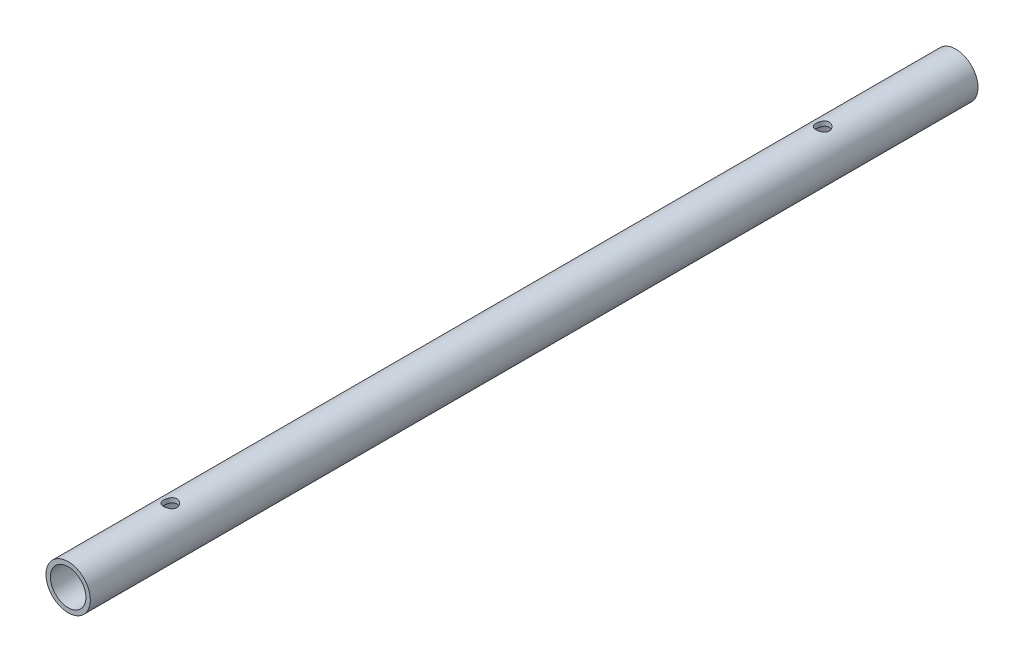
ISO-10303-21;
HEADER;
FILE_DESCRIPTION(('STEP AP214'),'2;1');
FILE_NAME('part.step','',(''),(''),'','','');
FILE_SCHEMA(('AUTOMOTIVE_DESIGN { 1 0 10303 214 1 1 1 1 }'));
ENDSEC;
DATA;
#1=APPLICATION_CONTEXT('core data for automotive mechanical design processes');
#2=APPLICATION_PROTOCOL_DEFINITION('international standard','automotive_design',2000,#1);
#3=PRODUCT_CONTEXT('',#1,'mechanical');
#4=PRODUCT('Part','Part','',(#3));
#5=PRODUCT_RELATED_PRODUCT_CATEGORY('part','',(#4));
#6=PRODUCT_DEFINITION_FORMATION('','',#4);
#7=PRODUCT_DEFINITION_CONTEXT('part definition',#1,'design');
#8=PRODUCT_DEFINITION('design','',#6,#7);
#9=PRODUCT_DEFINITION_SHAPE('','',#8);
#10=(LENGTH_UNIT() NAMED_UNIT(*) SI_UNIT(.MILLI.,.METRE.));
#11=(NAMED_UNIT(*) PLANE_ANGLE_UNIT() SI_UNIT($,.RADIAN.));
#12=(NAMED_UNIT(*) SI_UNIT($,.STERADIAN.) SOLID_ANGLE_UNIT());
#13=UNCERTAINTY_MEASURE_WITH_UNIT(LENGTH_MEASURE(1.E-05),#10,'distance_accuracy_value','');
#14=(GEOMETRIC_REPRESENTATION_CONTEXT(3) GLOBAL_UNCERTAINTY_ASSIGNED_CONTEXT((#13)) GLOBAL_UNIT_ASSIGNED_CONTEXT((#10,
#11,#12)) REPRESENTATION_CONTEXT('',''));
#15=CARTESIAN_POINT('',(0.,0.,0.));
#16=DIRECTION('',(0.,0.,1.));
#17=DIRECTION('',(1.,0.,0.));
#18=AXIS2_PLACEMENT_3D('',#15,#16,#17);
#19=CARTESIAN_POINT('',(0.,0.,200.));
#20=DIRECTION('',(0.,0.,-1.));
#21=DIRECTION('',(-1.,0.,0.));
#22=AXIS2_PLACEMENT_3D('',#19,#20,#21);
#23=CYLINDRICAL_SURFACE('',#22,5.);
#24=CARTESIAN_POINT('',(0.,0.,200.));
#25=DIRECTION('',(0.,0.,1.));
#26=DIRECTION('',(1.,0.,0.));
#27=AXIS2_PLACEMENT_3D('',#24,#25,#26);
#28=CIRCLE('',#27,5.);
#29=CARTESIAN_POINT('',(5.,0.,200.));
#30=VERTEX_POINT('',#29);
#31=EDGE_CURVE('E10',#30,#30,#28,.T.);
#32=ORIENTED_EDGE('',*,*,#31,.F.);
#33=EDGE_LOOP('',(#32));
#34=FACE_BOUND('',#33,.T.);
#35=CARTESIAN_POINT('',(0.,0.,0.));
#36=DIRECTION('',(0.,0.,1.));
#37=DIRECTION('',(1.,0.,0.));
#38=AXIS2_PLACEMENT_3D('',#35,#36,#37);
#39=CIRCLE('',#38,5.);
#40=CARTESIAN_POINT('',(5.,0.,0.));
#41=VERTEX_POINT('',#40);
#42=EDGE_CURVE('E52',#41,#41,#39,.T.);
#43=ORIENTED_EDGE('',*,*,#42,.T.);
#44=EDGE_LOOP('',(#43));
#45=FACE_BOUND('',#44,.T.);
#46=CARTESIAN_POINT('',(0.,5.,28.5));
#47=CARTESIAN_POINT('',(-0.0822886127532998,4.9999992925055,28.5000009974849));
#48=CARTESIAN_POINT('',(-0.164587318351529,4.99794915693954,28.506793863624));
#49=CARTESIAN_POINT('',(-0.32678812530488,4.98997105593691,28.5337213542221));
#50=CARTESIAN_POINT('',(-0.406689504411419,4.98404193389692,28.5538599580233));
#51=CARTESIAN_POINT('',(-0.561732707754526,4.96895552501836,28.6067460169103));
#52=CARTESIAN_POINT('',(-0.636881364395372,4.95980300250425,28.6394748696189));
#53=CARTESIAN_POINT('',(-0.78062418105313,4.93922109237645,28.7165360930558));
#54=CARTESIAN_POINT('',(-0.849217467469668,4.92779140192067,28.7608700073954));
#55=CARTESIAN_POINT('',(-0.979871797183743,4.90350737192774,28.8612240074727));
#56=CARTESIAN_POINT('',(-1.04171807124434,4.89062383657036,28.9175166258859));
#57=CARTESIAN_POINT('',(-1.15524920923324,4.86505834210442,29.0396092299102));
#58=CARTESIAN_POINT('',(-1.20693236327441,4.85237641724501,29.105410812125));
#59=CARTESIAN_POINT('',(-1.29980037723707,4.82834113993772,29.2464707530376));
#60=CARTESIAN_POINT('',(-1.34072309022213,4.81702406663875,29.3219084609907));
#61=CARTESIAN_POINT('',(-1.4092139477476,4.79743620394031,29.4789892542303));
#62=CARTESIAN_POINT('',(-1.43678529919973,4.78916468313311,29.560630843928));
#63=CARTESIAN_POINT('',(-1.47701633682652,4.77690870838434,29.7253902661305));
#64=CARTESIAN_POINT('',(-1.49007196234677,4.77281069324533,29.8084027438639));
#65=CARTESIAN_POINT('',(-1.50213730614672,4.76902789749767,29.9755331562168));
#66=CARTESIAN_POINT('',(-1.50115042761078,4.76934204760571,30.0596508180591));
#67=CARTESIAN_POINT('',(-1.48546977199812,4.77424744067778,30.2233839086085));
#68=CARTESIAN_POINT('',(-1.47127205262685,4.7786838859914,30.3030522503622));
#69=CARTESIAN_POINT('',(-1.43037420427056,4.79108356228624,30.4588197862735));
#70=CARTESIAN_POINT('',(-1.40367284141641,4.79904714132351,30.5349186273743));
#71=CARTESIAN_POINT('',(-1.33816026653682,4.81772733074973,30.6826003496607));
#72=CARTESIAN_POINT('',(-1.29918816934642,4.82848016115952,30.7541070839553));
#73=CARTESIAN_POINT('',(-1.21035222588683,4.85150987000065,30.8897320220102));
#74=CARTESIAN_POINT('',(-1.16048574002588,4.86378711746991,30.9538484294138));
#75=CARTESIAN_POINT('',(-1.04881290765546,4.88911011297937,31.075686190762));
#76=CARTESIAN_POINT('',(-0.986594907466973,4.90216654310498,31.1330286640297));
#77=CARTESIAN_POINT('',(-0.853263259313967,4.92712244063259,31.2365539840643));
#78=CARTESIAN_POINT('',(-0.782149051860888,4.9390218351841,31.2827361284144));
#79=CARTESIAN_POINT('',(-0.632355038342803,4.9604316006947,31.3628599224647));
#80=CARTESIAN_POINT('',(-0.553627749747951,4.96992543668314,31.3967175162499));
#81=CARTESIAN_POINT('',(-0.39124541560352,4.98533521832222,31.4505995900996));
#82=CARTESIAN_POINT('',(-0.307591751589582,4.99125216186999,31.4706279285325));
#83=CARTESIAN_POINT('',(-0.140952242668332,4.99868364643538,31.4956521778994));
#84=CARTESIAN_POINT('',(-0.0580500976011873,5.0003485041779,31.5011615858016));
#85=CARTESIAN_POINT('',(0.107499605823383,4.9995292324176,31.4984308442879));
#86=CARTESIAN_POINT('',(0.190147196690781,4.99704565677756,31.4901925303486));
#87=CARTESIAN_POINT('',(0.350903605309697,4.98830696987163,31.4606153888885));
#88=CARTESIAN_POINT('',(0.429072772614168,4.98213829799417,31.4395766124191));
#89=CARTESIAN_POINT('',(0.580754638954521,4.96674347841533,31.3853567672218));
#90=CARTESIAN_POINT('',(0.654266777025583,4.95751696321085,31.3521742389621));
#91=CARTESIAN_POINT('',(0.796437189461052,4.93669654351325,31.2737468345189));
#92=CARTESIAN_POINT('',(0.864943826199669,4.92505280829675,31.228240659052));
#93=CARTESIAN_POINT('',(0.993523307980145,4.90073468764318,31.1267752459472));
#94=CARTESIAN_POINT('',(1.05359403235593,4.8880600443108,31.0708133881123));
#95=CARTESIAN_POINT('',(1.16585744551027,4.86253171869138,30.9476126916307));
#96=CARTESIAN_POINT('',(1.21768481231504,4.84968825033268,30.8800381242283));
#97=CARTESIAN_POINT('',(1.30928995072154,4.82576515238463,30.7368720609865));
#98=CARTESIAN_POINT('',(1.34906803829472,4.81468547654651,30.6612807754418));
#99=CARTESIAN_POINT('',(1.41517347127168,4.79567189615055,30.5044675087453));
#100=CARTESIAN_POINT('',(1.4415634693705,4.78772337843827,30.4232738134634));
#101=CARTESIAN_POINT('',(1.48021730815114,4.77591594362794,30.2573120310685));
#102=CARTESIAN_POINT('',(1.49248598978779,4.772055625083,30.1725451792123));
#103=CARTESIAN_POINT('',(1.50221984485059,4.76899972496087,30.0056384816238));
#104=CARTESIAN_POINT('',(1.5002805530849,4.76961647442754,29.9235363489824));
#105=CARTESIAN_POINT('',(1.48307505444813,4.77499401288294,29.7608858966272));
#106=CARTESIAN_POINT('',(1.46780938124716,4.77975463592551,29.6803375148236));
#107=CARTESIAN_POINT('',(1.42476888804136,4.79275763670385,29.5240546008571));
#108=CARTESIAN_POINT('',(1.39715175507069,4.80095604545965,29.4482727126383));
#109=CARTESIAN_POINT('',(1.33031507121129,4.81990278909136,29.3023575611823));
#110=CARTESIAN_POINT('',(1.29109329962876,4.83065161194312,29.2322253823592));
#111=CARTESIAN_POINT('',(1.20048763805072,4.85397676425833,29.0968368834729));
#112=CARTESIAN_POINT('',(1.14871276092994,4.86660540163797,29.0318512387396));
#113=CARTESIAN_POINT('',(1.03517434629782,4.89201320450026,28.9112975016921));
#114=CARTESIAN_POINT('',(0.973408217134502,4.90479240823905,28.8557318605322));
#115=CARTESIAN_POINT('',(0.839465762183249,4.92950936570649,28.753976587705));
#116=CARTESIAN_POINT('',(0.767037885790609,4.94141159765674,28.7081085531445));
#117=CARTESIAN_POINT('',(0.615141373983531,4.96260680455813,28.629264830096));
#118=CARTESIAN_POINT('',(0.535676052998956,4.97190099931067,28.5962831117255));
#119=CARTESIAN_POINT('',(0.380757712655282,4.98602174969301,28.5471047243473));
#120=CARTESIAN_POINT('',(0.305786961954234,4.99122027381068,28.5294883271168));
#121=CARTESIAN_POINT('',(0.15388019523078,4.99820944494492,28.5059364747584));
#122=CARTESIAN_POINT('',(0.0769445098581397,5.0000006615474,28.4999990672952));
#123=CARTESIAN_POINT('',(0.,5.,28.5));
#124=B_SPLINE_CURVE_WITH_KNOTS('',3,(#46,#47,#48,#49,#50,#51,#52,#53,#54,#55,#56,#57,#58,#59,
#60,#61,#62,#63,#64,#65,#66,#67,#68,#69,#70,#71,#72,#73,#74,#75,#76,#77,#78,#79,#80,#81,#82,#83,
#84,#85,#86,#87,#88,#89,#90,#91,#92,#93,#94,#95,#96,#97,#98,#99,#100,#101,#102,#103,#104,#105,
#106,#107,#108,#109,#110,#111,#112,#113,#114,#115,#116,#117,#118,#119,#120,#121,#122,#123),
.UNSPECIFIED.,.T.,.F.,(4,2,2,2,2,2,2,2,2,2,2,2,2,2,2,2,2,2,2,2,2,2,2,2,2,2,2,2,2,2,2,2,2,2,2,2,
2,2,4),(0.,0.24658320361261,0.493239964845999,0.739533676300873,0.985860164412701,
1.23855602948191,1.49129437288633,1.74971481004109,2.00807314543224,2.25919689356599,
2.51025978319089,2.75226016697676,2.99428443658001,3.2396242644712,3.48502360158555,
3.74067104048167,3.99633456531072,4.25371046881689,4.51101453528808,4.75908809438545,
5.00712853550327,5.24956746682327,5.49203554593729,5.74011305702908,5.98825282000191,
6.24540400322819,6.50254844252681,6.75847814951252,7.01432009460283,7.25950155466943,
7.504673196616,7.74680040402721,7.98897397553107,8.23996925679931,8.49102974897502,
8.74942996156671,9.00770911595235,9.2383169193046,9.46888616948875),.UNSPECIFIED.);
#125=CARTESIAN_POINT('',(0.,5.,28.5));
#126=VERTEX_POINT('',#125);
#127=EDGE_CURVE('E68',#126,#126,#124,.T.);
#128=ORIENTED_EDGE('',*,*,#127,.F.);
#129=EDGE_LOOP('',(#128));
#130=FACE_BOUND('',#129,.T.);
#131=CARTESIAN_POINT('',(0.,5.,175.5));
#132=CARTESIAN_POINT('',(-0.0822886127532982,4.9999992925055,175.500000997485));
#133=CARTESIAN_POINT('',(-0.164587318351527,4.99794915693954,175.506793863624));
#134=CARTESIAN_POINT('',(-0.326788125304878,4.98997105593691,175.533721354222));
#135=CARTESIAN_POINT('',(-0.406689504411417,4.98404193389692,175.553859958023));
#136=CARTESIAN_POINT('',(-0.561732707754522,4.96895552501836,175.60674601691));
#137=CARTESIAN_POINT('',(-0.636881364395367,4.95980300250426,175.639474869619));
#138=CARTESIAN_POINT('',(-0.780624181053128,4.93922109237645,175.716536093056));
#139=CARTESIAN_POINT('',(-0.84921746746967,4.92779140192067,175.760870007395));
#140=CARTESIAN_POINT('',(-0.979871797183739,4.90350737192774,175.861224007473));
#141=CARTESIAN_POINT('',(-1.04171807124432,4.89062383657037,175.917516625886));
#142=CARTESIAN_POINT('',(-1.15524920923322,4.86505834210443,176.03960922991));
#143=CARTESIAN_POINT('',(-1.2069323632744,4.85237641724502,176.105410812125));
#144=CARTESIAN_POINT('',(-1.29980037723708,4.82834113993772,176.246470753038));
#145=CARTESIAN_POINT('',(-1.34072309022213,4.81702406663875,176.321908460991));
#146=CARTESIAN_POINT('',(-1.4092139477476,4.79743620394031,176.47898925423));
#147=CARTESIAN_POINT('',(-1.43678529919973,4.78916468313311,176.560630843928));
#148=CARTESIAN_POINT('',(-1.47701633682651,4.77690870838434,176.72539026613));
#149=CARTESIAN_POINT('',(-1.49007196234677,4.77281069324533,176.808402743864));
#150=CARTESIAN_POINT('',(-1.50213730614672,4.76902789749767,176.975533156217));
#151=CARTESIAN_POINT('',(-1.50115042761079,4.76934204760571,177.059650818059));
#152=CARTESIAN_POINT('',(-1.48546977199812,4.77424744067778,177.223383908608));
#153=CARTESIAN_POINT('',(-1.47127205262686,4.7786838859914,177.303052250362));
#154=CARTESIAN_POINT('',(-1.43037420427057,4.79108356228624,177.458819786273));
#155=CARTESIAN_POINT('',(-1.40367284141642,4.7990471413235,177.534918627374));
#156=CARTESIAN_POINT('',(-1.33816026653683,4.81772733074973,177.682600349661));
#157=CARTESIAN_POINT('',(-1.29918816934644,4.82848016115952,177.754107083955));
#158=CARTESIAN_POINT('',(-1.21035222588685,4.85150987000064,177.88973202201));
#159=CARTESIAN_POINT('',(-1.1604857400259,4.86378711746991,177.953848429414));
#160=CARTESIAN_POINT('',(-1.04881290765547,4.88911011297937,178.075686190762));
#161=CARTESIAN_POINT('',(-0.986594907466981,4.90216654310498,178.13302866403));
#162=CARTESIAN_POINT('',(-0.853263259313971,4.92712244063258,178.236553984064));
#163=CARTESIAN_POINT('',(-0.78214905186089,4.9390218351841,178.282736128414));
#164=CARTESIAN_POINT('',(-0.632355038342809,4.9604316006947,178.362859922465));
#165=CARTESIAN_POINT('',(-0.553627749747961,4.96992543668314,178.39671751625));
#166=CARTESIAN_POINT('',(-0.39124541560353,4.98533521832222,178.4505995901));
#167=CARTESIAN_POINT('',(-0.307591751589587,4.99125216186999,178.470627928533));
#168=CARTESIAN_POINT('',(-0.140952242668334,4.99868364643538,178.495652177899));
#169=CARTESIAN_POINT('',(-0.0580500976011905,5.0003485041779,178.501161585802));
#170=CARTESIAN_POINT('',(0.107499605823378,4.9995292324176,178.498430844288));
#171=CARTESIAN_POINT('',(0.190147196690776,4.99704565677756,178.490192530349));
#172=CARTESIAN_POINT('',(0.350903605309692,4.98830696987163,178.460615388889));
#173=CARTESIAN_POINT('',(0.429072772614164,4.98213829799417,178.439576612419));
#174=CARTESIAN_POINT('',(0.580754638954517,4.96674347841533,178.385356767222));
#175=CARTESIAN_POINT('',(0.654266777025579,4.95751696321085,178.352174238962));
#176=CARTESIAN_POINT('',(0.796437189461054,4.93669654351325,178.273746834519));
#177=CARTESIAN_POINT('',(0.864943826199676,4.92505280829675,178.228240659052));
#178=CARTESIAN_POINT('',(0.993523307980154,4.90073468764317,178.126775245947));
#179=CARTESIAN_POINT('',(1.05359403235594,4.8880600443108,178.070813388112));
#180=CARTESIAN_POINT('',(1.16585744551027,4.86253171869138,177.947612691631));
#181=CARTESIAN_POINT('',(1.21768481231504,4.84968825033268,177.880038124228));
#182=CARTESIAN_POINT('',(1.30928995072154,4.82576515238463,177.736872060986));
#183=CARTESIAN_POINT('',(1.34906803829472,4.81468547654651,177.661280775442));
#184=CARTESIAN_POINT('',(1.41517347127168,4.79567189615055,177.504467508745));
#185=CARTESIAN_POINT('',(1.4415634693705,4.78772337843827,177.423273813463));
#186=CARTESIAN_POINT('',(1.48021730815114,4.77591594362794,177.257312031069));
#187=CARTESIAN_POINT('',(1.49248598978779,4.772055625083,177.172545179212));
#188=CARTESIAN_POINT('',(1.50221984485059,4.76899972496087,177.005638481624));
#189=CARTESIAN_POINT('',(1.5002805530849,4.76961647442754,176.923536348982));
#190=CARTESIAN_POINT('',(1.48307505444813,4.77499401288294,176.760885896627));
#191=CARTESIAN_POINT('',(1.46780938124716,4.77975463592551,176.680337514824));
#192=CARTESIAN_POINT('',(1.42476888804135,4.79275763670386,176.524054600857));
#193=CARTESIAN_POINT('',(1.39715175507068,4.80095604545965,176.448272712638));
#194=CARTESIAN_POINT('',(1.33031507121128,4.81990278909137,176.302357561182));
#195=CARTESIAN_POINT('',(1.29109329962875,4.83065161194312,176.232225382359));
#196=CARTESIAN_POINT('',(1.20048763805072,4.85397676425833,176.096836883473));
#197=CARTESIAN_POINT('',(1.14871276092995,4.86660540163797,176.03185123874));
#198=CARTESIAN_POINT('',(1.03517434629783,4.89201320450026,175.911297501692));
#199=CARTESIAN_POINT('',(0.973408217134508,4.90479240823905,175.855731860532));
#200=CARTESIAN_POINT('',(0.839465762183249,4.92950936570649,175.753976587705));
#201=CARTESIAN_POINT('',(0.76703788579061,4.94141159765674,175.708108553145));
#202=CARTESIAN_POINT('',(0.615141373983533,4.96260680455813,175.629264830096));
#203=CARTESIAN_POINT('',(0.535676052998957,4.97190099931066,175.596283111726));
#204=CARTESIAN_POINT('',(0.380757712655281,4.98602174969301,175.547104724347));
#205=CARTESIAN_POINT('',(0.305786961954233,4.99122027381068,175.529488327117));
#206=CARTESIAN_POINT('',(0.153880195230779,4.99820944494492,175.505936474758));
#207=CARTESIAN_POINT('',(0.0769445098581397,5.0000006615474,175.499999067295));
#208=CARTESIAN_POINT('',(0.,5.,175.5));
#209=B_SPLINE_CURVE_WITH_KNOTS('',3,(#131,#132,#133,#134,#135,#136,#137,#138,#139,#140,#141,
#142,#143,#144,#145,#146,#147,#148,#149,#150,#151,#152,#153,#154,#155,#156,#157,#158,#159,#160,
#161,#162,#163,#164,#165,#166,#167,#168,#169,#170,#171,#172,#173,#174,#175,#176,#177,#178,#179,
#180,#181,#182,#183,#184,#185,#186,#187,#188,#189,#190,#191,#192,#193,#194,#195,#196,#197,#198,
#199,#200,#201,#202,#203,#204,#205,#206,#207,#208),.UNSPECIFIED.,.T.,.F.,(4,2,2,2,2,2,2,2,2,2,2,
2,2,2,2,2,2,2,2,2,2,2,2,2,2,2,2,2,2,2,2,2,2,2,2,2,2,2,4),(0.,0.246583203612607,
0.493239964845998,0.739533676300867,0.98586016441269,1.23855602948189,1.49129437288632,
1.74971481004107,2.00807314543224,2.25919689356596,2.51025978319089,2.75226016697672,
2.99428443657997,3.23962426447116,3.48502360158553,3.74067104048166,3.9963345653107,
4.25371046881687,4.51101453528807,4.75908809438544,5.00712853550326,5.24956746682326,
5.49203554593728,5.74011305702909,5.98825282000192,6.24540400322818,6.50254844252681,
6.75847814951252,7.01432009460283,7.25950155466945,7.50467319661602,7.74680040402722,
7.98897397553108,8.23996925679928,8.49102974897502,8.74942996156669,9.00770911595235,
9.23831691930459,9.46888616948874),.UNSPECIFIED.);
#210=CARTESIAN_POINT('',(0.,5.,175.5));
#211=VERTEX_POINT('',#210);
#212=EDGE_CURVE('E86',#211,#211,#209,.T.);
#213=ORIENTED_EDGE('',*,*,#212,.F.);
#214=EDGE_LOOP('',(#213));
#215=FACE_BOUND('',#214,.T.);
#216=ADVANCED_FACE('F39',(#34,#45,#130,#215),#23,.T.);
#217=CARTESIAN_POINT('',(0.,0.,200.));
#218=DIRECTION('',(0.,0.,-1.));
#219=DIRECTION('',(-1.,0.,0.));
#220=AXIS2_PLACEMENT_3D('',#217,#218,#219);
#221=CYLINDRICAL_SURFACE('',#220,4.);
#222=CARTESIAN_POINT('',(0.,4.,28.5));
#223=CARTESIAN_POINT('',(-0.0812350589378528,4.00000217456151,28.4999970976969));
#224=CARTESIAN_POINT('',(-0.162450241781792,3.99750379283184,28.5066197602484));
#225=CARTESIAN_POINT('',(-0.322453452352361,3.98778696006928,28.5328281952699));
#226=CARTESIAN_POINT('',(-0.401241827987616,3.98056918893993,28.5524121004706));
#227=CARTESIAN_POINT('',(-0.554060784990879,3.96218832391545,28.6037530017718));
#228=CARTESIAN_POINT('',(-0.628100224162277,3.9510328434944,28.6354865168218));
#229=CARTESIAN_POINT('',(-0.769799310160254,3.92588767765353,28.7101064130158));
#230=CARTESIAN_POINT('',(-0.83745723917788,3.91189723227548,28.7529957855442));
#231=CARTESIAN_POINT('',(-0.967346417045826,3.88186246971217,28.8506125310709));
#232=CARTESIAN_POINT('',(-1.02927073015119,3.86576002583566,28.9057302622594));
#233=CARTESIAN_POINT('',(-1.14324421474363,3.83360220871327,29.0254104346588));
#234=CARTESIAN_POINT('',(-1.19529036359203,3.81754685135033,29.0899757560879));
#235=CARTESIAN_POINT('',(-1.28998202215985,3.78662470617731,29.2297174675232));
#236=CARTESIAN_POINT('',(-1.3321939319576,3.77182648820818,29.3052043665458));
#237=CARTESIAN_POINT('',(-1.40318646334085,3.74599860237433,29.4628483541685));
#238=CARTESIAN_POINT('',(-1.43197244961239,3.73496742975881,29.5450027631551));
#239=CARTESIAN_POINT('',(-1.47408431017549,3.71854412824136,29.7101167402582));
#240=CARTESIAN_POINT('',(-1.48799593218558,3.71293924350838,29.7929050384354));
#241=CARTESIAN_POINT('',(-1.50179556531648,3.70738061461215,29.9598161579938));
#242=CARTESIAN_POINT('',(-1.50168936802631,3.70742453659305,30.0439384138745));
#243=CARTESIAN_POINT('',(-1.48790429610018,3.71297511632055,30.205769525213));
#244=CARTESIAN_POINT('',(-1.47503808509004,3.71815468871122,30.2835609060442));
#245=CARTESIAN_POINT('',(-1.4374416786833,3.73284938059529,30.4357871504053));
#246=CARTESIAN_POINT('',(-1.41270969663258,3.74236515298863,30.5102215066139));
#247=CARTESIAN_POINT('',(-1.35163748571904,3.76485702190253,30.6552770677282));
#248=CARTESIAN_POINT('',(-1.31508648737101,3.77789517988166,30.7257994861213));
#249=CARTESIAN_POINT('',(-1.23156073762698,3.80594210139319,30.859945737591));
#250=CARTESIAN_POINT('',(-1.18458238728897,3.82095154457158,30.9235671775197));
#251=CARTESIAN_POINT('',(-1.07781780766549,3.85248038859113,31.0466036636509));
#252=CARTESIAN_POINT('',(-1.01738298716955,3.86903347455671,31.1054486407481));
#253=CARTESIAN_POINT('',(-0.887312590819018,3.90091728164086,31.2123379662058));
#254=CARTESIAN_POINT('',(-0.81767560349736,3.91624781465952,31.2603806546057));
#255=CARTESIAN_POINT('',(-0.669723436992415,3.9442639480908,31.3449303970625));
#256=CARTESIAN_POINT('',(-0.591290713844716,3.95690498259616,31.3812475812211));
#257=CARTESIAN_POINT('',(-0.428836850524581,3.97778718326962,31.43998260427));
#258=CARTESIAN_POINT('',(-0.344818210845766,3.98603030341493,31.4624066165611));
#259=CARTESIAN_POINT('',(-0.178375243148664,3.99684443228065,31.4916227875419));
#260=CARTESIAN_POINT('',(-0.0961036195622085,3.99969369025686,31.4991826063825));
#261=CARTESIAN_POINT('',(0.0685724752550246,4.00025893700126,31.5006910638999));
#262=CARTESIAN_POINT('',(0.150976912983373,3.99797606386863,31.4946427203168));
#263=CARTESIAN_POINT('',(0.31026204856186,3.98871709772643,31.4696899576913));
#264=CARTESIAN_POINT('',(0.387233328007337,3.98192470962305,31.4512884562629));
#265=CARTESIAN_POINT('',(0.536941754957222,3.96451477091717,31.4028139274527));
#266=CARTESIAN_POINT('',(0.609678350347535,3.9538967228203,31.372739382052));
#267=CARTESIAN_POINT('',(0.751247765110155,3.92949624407681,31.3008135875605));
#268=CARTESIAN_POINT('',(0.819903083557796,3.91563000209348,31.2586422707766));
#269=CARTESIAN_POINT('',(0.949392711726626,3.88626671564664,31.1640818968284));
#270=CARTESIAN_POINT('',(1.01022412027045,3.87076907009516,31.1116890674548));
#271=CARTESIAN_POINT('',(1.12603079874454,3.83873329490989,30.9945958778757));
#272=CARTESIAN_POINT('',(1.18046154123569,3.82218696503729,30.9293578172273));
#273=CARTESIAN_POINT('',(1.27771050031903,3.79078815746854,30.7903486152923));
#274=CARTESIAN_POINT('',(1.32052767414519,3.77593583194399,30.7165767086115));
#275=CARTESIAN_POINT('',(1.39337773518998,3.74966829822463,30.5619840132277));
#276=CARTESIAN_POINT('',(1.42335685446918,3.73826760328493,30.4811352540896));
#277=CARTESIAN_POINT('',(1.46907883466889,3.72054032891005,30.3149902363122));
#278=CARTESIAN_POINT('',(1.48483050305535,3.71421061057491,30.2296967638019));
#279=CARTESIAN_POINT('',(1.50086347097839,3.70775894792573,30.0629838404589));
#280=CARTESIAN_POINT('',(1.50207331495837,3.70726444523341,29.9816673682831));
#281=CARTESIAN_POINT('',(1.49136715641593,3.71158412745292,29.8200546837238));
#282=CARTESIAN_POINT('',(1.47945239850124,3.71639780898899,29.7397583753284));
#283=CARTESIAN_POINT('',(1.44355815630242,3.73048141585432,29.5849527732834));
#284=CARTESIAN_POINT('',(1.41995798316524,3.73961085376663,29.5103416537547));
#285=CARTESIAN_POINT('',(1.3616969677992,3.76121548297845,29.3660944915056));
#286=CARTESIAN_POINT('',(1.32703332944945,3.77369151995215,29.2964597119299));
#287=CARTESIAN_POINT('',(1.24552075938154,3.80139723903965,29.1601732103024));
#288=CARTESIAN_POINT('',(1.1981283280301,3.81673698440964,29.0938692032001));
#289=CARTESIAN_POINT('',(1.09334485729906,3.84806246757177,28.9698584390288));
#290=CARTESIAN_POINT('',(1.03595064012808,3.86404840943145,28.9121544252132));
#291=CARTESIAN_POINT('',(0.909080396784623,3.89590424609881,28.8037980441782));
#292=CARTESIAN_POINT('',(0.839118644212992,3.91172104900645,28.7536962465653));
#293=CARTESIAN_POINT('',(0.691213223200821,3.9405451445703,28.6659773447234));
#294=CARTESIAN_POINT('',(0.613268934090622,3.95355221851559,28.6283612122636));
#295=CARTESIAN_POINT('',(0.447999082002312,3.9757429260668,28.5656231709517));
#296=CARTESIAN_POINT('',(0.360413422234208,3.98473657158356,28.5411129353981));
#297=CARTESIAN_POINT('',(0.181875733606382,3.99686242179587,28.5083070400793));
#298=CARTESIAN_POINT('',(0.0909254163648589,3.99999756603967,28.5000032485127));
#299=CARTESIAN_POINT('',(0.,4.,28.5));
#300=B_SPLINE_CURVE_WITH_KNOTS('',3,(#222,#223,#224,#225,#226,#227,#228,#229,#230,#231,#232,
#233,#234,#235,#236,#237,#238,#239,#240,#241,#242,#243,#244,#245,#246,#247,#248,#249,#250,#251,
#252,#253,#254,#255,#256,#257,#258,#259,#260,#261,#262,#263,#264,#265,#266,#267,#268,#269,#270,
#271,#272,#273,#274,#275,#276,#277,#278,#279,#280,#281,#282,#283,#284,#285,#286,#287,#288,#289,
#290,#291,#292,#293,#294,#295,#296,#297,#298,#299),.UNSPECIFIED.,.T.,.F.,(4,2,2,2,2,2,2,2,2,2,2,
2,2,2,2,2,2,2,2,2,2,2,2,2,2,2,2,2,2,2,2,2,2,2,2,2,2,2,4),(0.,0.24336980156056,0.48670454953046,
0.729571369213572,0.972503379609492,1.22473618582716,1.47704604925622,1.73896674501659,
2.00078269352134,2.25185874416902,2.50283106079707,2.73878345119971,2.97477138060589,
3.21522408387019,3.45575990744259,3.71246153335813,3.96920257905067,4.22991375286076,
4.49050899698846,4.73725019635926,4.98393668390521,5.2211443792384,5.45838293254454,
5.702592218596,5.94689180019868,6.20536519455658,6.46386178920141,6.72343066727204,
6.98283874956507,7.22558763480252,7.4683135021126,7.70363142426534,7.93900886656507,
8.18672471884272,8.43451941997062,8.69572329654039,8.95694749805102,9.22948515032042,
9.50188601796128),.UNSPECIFIED.);
#301=CARTESIAN_POINT('',(0.,4.,28.5));
#302=VERTEX_POINT('',#301);
#303=EDGE_CURVE('E62',#302,#302,#300,.T.);
#304=ORIENTED_EDGE('',*,*,#303,.T.);
#305=EDGE_LOOP('',(#304));
#306=FACE_BOUND('',#305,.T.);
#307=CARTESIAN_POINT('',(0.,0.,200.));
#308=DIRECTION('',(0.,0.,1.));
#309=DIRECTION('',(1.,0.,0.));
#310=AXIS2_PLACEMENT_3D('',#307,#308,#309);
#311=CIRCLE('',#310,4.);
#312=CARTESIAN_POINT('',(4.,0.,200.));
#313=VERTEX_POINT('',#312);
#314=EDGE_CURVE('E57',#313,#313,#311,.T.);
#315=ORIENTED_EDGE('',*,*,#314,.T.);
#316=EDGE_LOOP('',(#315));
#317=FACE_BOUND('',#316,.T.);
#318=CARTESIAN_POINT('',(0.,0.,0.));
#319=DIRECTION('',(0.,0.,1.));
#320=DIRECTION('',(1.,0.,0.));
#321=AXIS2_PLACEMENT_3D('',#318,#319,#320);
#322=CIRCLE('',#321,4.);
#323=CARTESIAN_POINT('',(4.,0.,0.));
#324=VERTEX_POINT('',#323);
#325=EDGE_CURVE('E60',#324,#324,#322,.T.);
#326=ORIENTED_EDGE('',*,*,#325,.F.);
#327=EDGE_LOOP('',(#326));
#328=FACE_BOUND('',#327,.T.);
#329=CARTESIAN_POINT('',(0.,4.,175.5));
#330=CARTESIAN_POINT('',(-0.081235058937853,4.00000217456151,175.499997097697));
#331=CARTESIAN_POINT('',(-0.162450241781792,3.99750379283184,175.506619760248));
#332=CARTESIAN_POINT('',(-0.32245345235236,3.98778696006928,175.53282819527));
#333=CARTESIAN_POINT('',(-0.401241827987614,3.98056918893993,175.552412100471));
#334=CARTESIAN_POINT('',(-0.554060784990879,3.96218832391545,175.603753001772));
#335=CARTESIAN_POINT('',(-0.62810022416228,3.9510328434944,175.635486516822));
#336=CARTESIAN_POINT('',(-0.769799310160252,3.92588767765353,175.710106413016));
#337=CARTESIAN_POINT('',(-0.837457239177872,3.91189723227548,175.752995785544));
#338=CARTESIAN_POINT('',(-0.967346417045813,3.88186246971217,175.850612531071));
#339=CARTESIAN_POINT('',(-1.02927073015118,3.86576002583566,175.905730262259));
#340=CARTESIAN_POINT('',(-1.14324421474362,3.83360220871327,176.025410434659));
#341=CARTESIAN_POINT('',(-1.19529036359202,3.81754685135033,176.089975756088));
#342=CARTESIAN_POINT('',(-1.28998202215984,3.78662470617732,176.229717467523));
#343=CARTESIAN_POINT('',(-1.33219393195759,3.77182648820819,176.305204366546));
#344=CARTESIAN_POINT('',(-1.40318646334084,3.74599860237433,176.462848354169));
#345=CARTESIAN_POINT('',(-1.43197244961239,3.73496742975881,176.545002763155));
#346=CARTESIAN_POINT('',(-1.47408431017549,3.71854412824136,176.710116740258));
#347=CARTESIAN_POINT('',(-1.48799593218558,3.71293924350838,176.792905038435));
#348=CARTESIAN_POINT('',(-1.50179556531648,3.70738061461215,176.959816157994));
#349=CARTESIAN_POINT('',(-1.50168936802631,3.70742453659305,177.043938413874));
#350=CARTESIAN_POINT('',(-1.48790429610019,3.71297511632054,177.205769525213));
#351=CARTESIAN_POINT('',(-1.47503808509004,3.71815468871121,177.283560906044));
#352=CARTESIAN_POINT('',(-1.4374416786833,3.7328493805953,177.435787150405));
#353=CARTESIAN_POINT('',(-1.41270969663259,3.74236515298863,177.510221506614));
#354=CARTESIAN_POINT('',(-1.35163748571904,3.76485702190253,177.655277067728));
#355=CARTESIAN_POINT('',(-1.31508648737102,3.77789517988165,177.725799486121));
#356=CARTESIAN_POINT('',(-1.23156073762699,3.80594210139319,177.859945737591));
#357=CARTESIAN_POINT('',(-1.18458238728898,3.82095154457157,177.92356717752));
#358=CARTESIAN_POINT('',(-1.0778178076655,3.85248038859113,178.046603663651));
#359=CARTESIAN_POINT('',(-1.01738298716958,3.8690334745567,178.105448640748));
#360=CARTESIAN_POINT('',(-0.887312590819044,3.90091728164085,178.212337966206));
#361=CARTESIAN_POINT('',(-0.817675603497383,3.91624781465952,178.260380654606));
#362=CARTESIAN_POINT('',(-0.669723436992432,3.9442639480908,178.344930397063));
#363=CARTESIAN_POINT('',(-0.591290713844729,3.95690498259616,178.381247581221));
#364=CARTESIAN_POINT('',(-0.428836850524589,3.97778718326962,178.43998260427));
#365=CARTESIAN_POINT('',(-0.34481821084577,3.98603030341493,178.462406616561));
#366=CARTESIAN_POINT('',(-0.178375243148667,3.99684443228065,178.491622787542));
#367=CARTESIAN_POINT('',(-0.0961036195622119,3.99969369025686,178.499182606383));
#368=CARTESIAN_POINT('',(0.0685724752550189,4.00025893700126,178.5006910639));
#369=CARTESIAN_POINT('',(0.150976912983366,3.99797606386863,178.494642720317));
#370=CARTESIAN_POINT('',(0.310262048561853,3.98871709772643,178.469689957691));
#371=CARTESIAN_POINT('',(0.387233328007332,3.98192470962305,178.451288456263));
#372=CARTESIAN_POINT('',(0.536941754957218,3.96451477091717,178.402813927453));
#373=CARTESIAN_POINT('',(0.60967835034753,3.9538967228203,178.372739382052));
#374=CARTESIAN_POINT('',(0.751247765110154,3.92949624407682,178.300813587561));
#375=CARTESIAN_POINT('',(0.819903083557797,3.91563000209348,178.258642270777));
#376=CARTESIAN_POINT('',(0.949392711726625,3.88626671564664,178.164081896828));
#377=CARTESIAN_POINT('',(1.01022412027045,3.87076907009516,178.111689067455));
#378=CARTESIAN_POINT('',(1.12603079874453,3.8387332949099,177.994595877876));
#379=CARTESIAN_POINT('',(1.18046154123568,3.8221869650373,177.929357817227));
#380=CARTESIAN_POINT('',(1.27771050031903,3.79078815746854,177.790348615292));
#381=CARTESIAN_POINT('',(1.32052767414518,3.77593583194399,177.716576708612));
#382=CARTESIAN_POINT('',(1.39337773518998,3.74966829822463,177.561984013228));
#383=CARTESIAN_POINT('',(1.42335685446918,3.73826760328493,177.48113525409));
#384=CARTESIAN_POINT('',(1.46907883466889,3.72054032891005,177.314990236312));
#385=CARTESIAN_POINT('',(1.48483050305535,3.7142106105749,177.229696763802));
#386=CARTESIAN_POINT('',(1.50086347097839,3.70775894792573,177.062983840459));
#387=CARTESIAN_POINT('',(1.50207331495837,3.70726444523341,176.981667368283));
#388=CARTESIAN_POINT('',(1.49136715641593,3.71158412745292,176.820054683724));
#389=CARTESIAN_POINT('',(1.47945239850123,3.71639780898899,176.739758375328));
#390=CARTESIAN_POINT('',(1.44355815630242,3.73048141585432,176.584952773283));
#391=CARTESIAN_POINT('',(1.41995798316524,3.73961085376663,176.510341653755));
#392=CARTESIAN_POINT('',(1.36169696779919,3.76121548297845,176.366094491506));
#393=CARTESIAN_POINT('',(1.32703332944945,3.77369151995215,176.29645971193));
#394=CARTESIAN_POINT('',(1.24552075938154,3.80139723903964,176.160173210302));
#395=CARTESIAN_POINT('',(1.19812832803011,3.81673698440964,176.0938692032));
#396=CARTESIAN_POINT('',(1.09334485729907,3.84806246757177,175.969858439029));
#397=CARTESIAN_POINT('',(1.03595064012809,3.86404840943145,175.912154425213));
#398=CARTESIAN_POINT('',(0.909080396784635,3.89590424609881,175.803798044178));
#399=CARTESIAN_POINT('',(0.839118644213008,3.91172104900644,175.753696246565));
#400=CARTESIAN_POINT('',(0.691213223200838,3.9405451445703,175.665977344723));
#401=CARTESIAN_POINT('',(0.613268934090637,3.95355221851559,175.628361212264));
#402=CARTESIAN_POINT('',(0.447999082002324,3.9757429260668,175.565623170952));
#403=CARTESIAN_POINT('',(0.360413422234218,3.98473657158356,175.541112935398));
#404=CARTESIAN_POINT('',(0.181875733606387,3.99686242179587,175.508307040079));
#405=CARTESIAN_POINT('',(0.0909254163648608,3.99999756603967,175.500003248513));
#406=CARTESIAN_POINT('',(0.,4.,175.5));
#407=B_SPLINE_CURVE_WITH_KNOTS('',3,(#329,#330,#331,#332,#333,#334,#335,#336,#337,#338,#339,
#340,#341,#342,#343,#344,#345,#346,#347,#348,#349,#350,#351,#352,#353,#354,#355,#356,#357,#358,
#359,#360,#361,#362,#363,#364,#365,#366,#367,#368,#369,#370,#371,#372,#373,#374,#375,#376,#377,
#378,#379,#380,#381,#382,#383,#384,#385,#386,#387,#388,#389,#390,#391,#392,#393,#394,#395,#396,
#397,#398,#399,#400,#401,#402,#403,#404,#405,#406),.UNSPECIFIED.,.T.,.F.,(4,2,2,2,2,2,2,2,2,2,2,
2,2,2,2,2,2,2,2,2,2,2,2,2,2,2,2,2,2,2,2,2,2,2,2,2,2,2,4),(0.,0.24336980156056,0.486704549530457,
0.729571369213577,0.972503379609478,1.22473618582713,1.4770460492562,1.73896674501658,
2.00078269352132,2.25185874416899,2.50283106079705,2.73878345119972,2.97477138060589,
3.21522408387016,3.45575990744256,3.71246153335811,3.96920257905065,4.22991375286075,
4.49050899698846,4.73725019635926,4.9839366839052,5.2211443792384,5.45838293254454,
5.702592218596,5.94689180019868,6.20536519455658,6.46386178920141,6.72343066727206,
6.9828387495651,7.22558763480255,7.4683135021126,7.70363142426538,7.93900886656505,
8.18672471884271,8.43451941997061,8.69572329654038,8.95694749805102,9.22948515032043,
9.50188601796129),.UNSPECIFIED.);
#408=CARTESIAN_POINT('',(0.,4.,175.5));
#409=VERTEX_POINT('',#408);
#410=EDGE_CURVE('E43',#409,#409,#407,.T.);
#411=ORIENTED_EDGE('',*,*,#410,.T.);
#412=EDGE_LOOP('',(#411));
#413=FACE_BOUND('',#412,.T.);
#414=ADVANCED_FACE('F69',(#306,#317,#328,#413),#221,.F.);
#415=CARTESIAN_POINT('',(0.,0.,200.));
#416=DIRECTION('',(0.,0.,1.));
#417=DIRECTION('',(1.,0.,0.));
#418=AXIS2_PLACEMENT_3D('',#415,#416,#417);
#419=PLANE('',#418);
#420=ORIENTED_EDGE('',*,*,#31,.T.);
#421=EDGE_LOOP('',(#420));
#422=FACE_BOUND('',#421,.T.);
#423=ORIENTED_EDGE('',*,*,#314,.F.);
#424=EDGE_LOOP('',(#423));
#425=FACE_BOUND('',#424,.T.);
#426=ADVANCED_FACE('F100',(#422,#425),#419,.T.);
#427=CARTESIAN_POINT('',(0.,0.,0.));
#428=DIRECTION('',(0.,0.,1.));
#429=DIRECTION('',(1.,0.,0.));
#430=AXIS2_PLACEMENT_3D('',#427,#428,#429);
#431=PLANE('',#430);
#432=ORIENTED_EDGE('',*,*,#42,.F.);
#433=EDGE_LOOP('',(#432));
#434=FACE_BOUND('',#433,.T.);
#435=ORIENTED_EDGE('',*,*,#325,.T.);
#436=EDGE_LOOP('',(#435));
#437=FACE_BOUND('',#436,.T.);
#438=ADVANCED_FACE('F76',(#434,#437),#431,.F.);
#439=CARTESIAN_POINT('',(0.,5.,30.));
#440=DIRECTION('',(0.,-1.,0.));
#441=DIRECTION('',(0.,0.,-1.));
#442=AXIS2_PLACEMENT_3D('',#439,#440,#441);
#443=CYLINDRICAL_SURFACE('',#442,1.5);
#444=ORIENTED_EDGE('',*,*,#303,.F.);
#445=EDGE_LOOP('',(#444));
#446=FACE_BOUND('',#445,.T.);
#447=ORIENTED_EDGE('',*,*,#127,.T.);
#448=EDGE_LOOP('',(#447));
#449=FACE_BOUND('',#448,.T.);
#450=ADVANCED_FACE('F72',(#446,#449),#443,.F.);
#451=CARTESIAN_POINT('',(0.,5.,177.));
#452=DIRECTION('',(0.,-1.,0.));
#453=DIRECTION('',(0.,0.,-1.));
#454=AXIS2_PLACEMENT_3D('',#451,#452,#453);
#455=CYLINDRICAL_SURFACE('',#454,1.5);
#456=ORIENTED_EDGE('',*,*,#410,.F.);
#457=EDGE_LOOP('',(#456));
#458=FACE_BOUND('',#457,.T.);
#459=ORIENTED_EDGE('',*,*,#212,.T.);
#460=EDGE_LOOP('',(#459));
#461=FACE_BOUND('',#460,.T.);
#462=ADVANCED_FACE('F75',(#458,#461),#455,.F.);
#463=CLOSED_SHELL('',(#216,#414,#426,#438,#450,#462));
#464=MANIFOLD_SOLID_BREP('B2',#463);
#465=ADVANCED_BREP_SHAPE_REPRESENTATION('',(#18,#464),#14);
#466=SHAPE_DEFINITION_REPRESENTATION(#9,#465);
ENDSEC;
END-ISO-10303-21;
